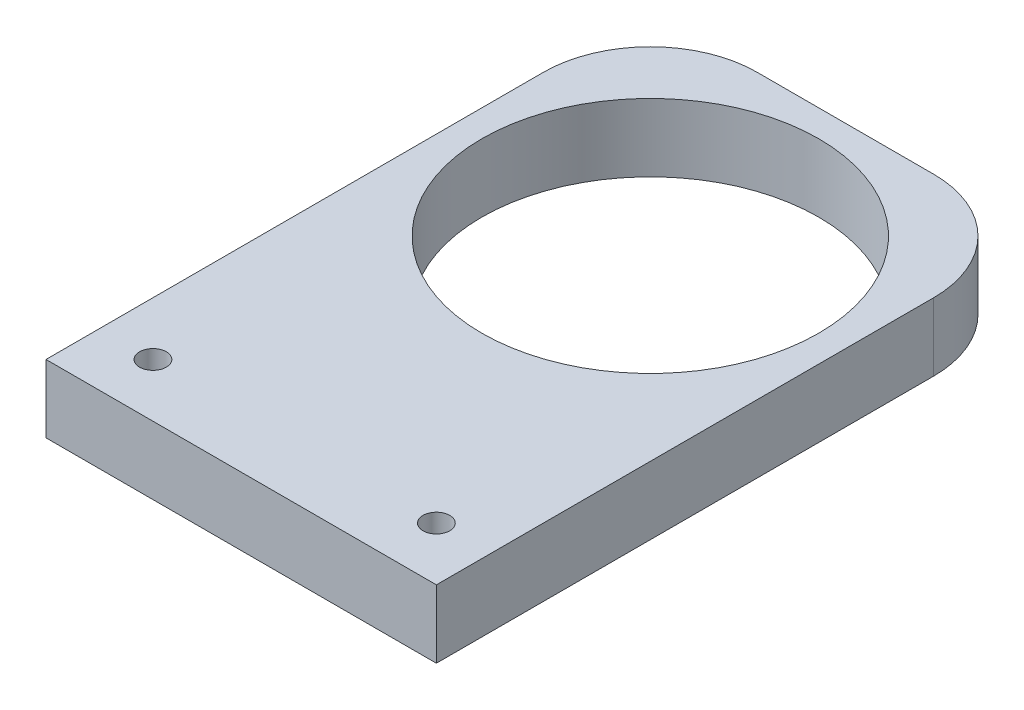
ISO-10303-21;
HEADER;
FILE_DESCRIPTION(('STEP AP214'),'2;1');
FILE_NAME('part.step','',(''),(''),'','','');
FILE_SCHEMA(('AUTOMOTIVE_DESIGN { 1 0 10303 214 1 1 1 1 }'));
ENDSEC;
DATA;
#1=APPLICATION_CONTEXT('core data for automotive mechanical design processes');
#2=APPLICATION_PROTOCOL_DEFINITION('international standard','automotive_design',2000,#1);
#3=PRODUCT_CONTEXT('',#1,'mechanical');
#4=PRODUCT('Part','Part','',(#3));
#5=PRODUCT_RELATED_PRODUCT_CATEGORY('part','',(#4));
#6=PRODUCT_DEFINITION_FORMATION('','',#4);
#7=PRODUCT_DEFINITION_CONTEXT('part definition',#1,'design');
#8=PRODUCT_DEFINITION('design','',#6,#7);
#9=PRODUCT_DEFINITION_SHAPE('','',#8);
#10=(LENGTH_UNIT() NAMED_UNIT(*) SI_UNIT(.MILLI.,.METRE.));
#11=(NAMED_UNIT(*) PLANE_ANGLE_UNIT() SI_UNIT($,.RADIAN.));
#12=(NAMED_UNIT(*) SI_UNIT($,.STERADIAN.) SOLID_ANGLE_UNIT());
#13=UNCERTAINTY_MEASURE_WITH_UNIT(LENGTH_MEASURE(1.E-05),#10,'distance_accuracy_value','');
#14=(GEOMETRIC_REPRESENTATION_CONTEXT(3) GLOBAL_UNCERTAINTY_ASSIGNED_CONTEXT((#13)) GLOBAL_UNIT_ASSIGNED_CONTEXT((#10,
#11,#12)) REPRESENTATION_CONTEXT('',''));
#15=CARTESIAN_POINT('',(0.,0.,0.));
#16=DIRECTION('',(0.,0.,1.));
#17=DIRECTION('',(1.,0.,0.));
#18=AXIS2_PLACEMENT_3D('',#15,#16,#17);
#19=CARTESIAN_POINT('',(0.,6.35,0.));
#20=DIRECTION('',(0.,-1.,0.));
#21=DIRECTION('',(0.,0.,-1.));
#22=AXIS2_PLACEMENT_3D('',#19,#20,#21);
#23=PLANE('',#22);
#24=DIRECTION('',(-1.,0.,0.));
#25=VECTOR('',#24,1.);
#26=CARTESIAN_POINT('',(-36.5,6.35,-36.5));
#27=LINE('',#26,#25);
#28=CARTESIAN_POINT('',(16.5,6.35,-36.5));
#29=VERTEX_POINT('',#28);
#30=CARTESIAN_POINT('',(-16.5,6.35,-36.5));
#31=VERTEX_POINT('',#30);
#32=EDGE_CURVE('E129',#29,#31,#27,.T.);
#33=ORIENTED_EDGE('',*,*,#32,.T.);
#34=CARTESIAN_POINT('',(-16.5,6.35,-16.5));
#35=DIRECTION('',(0.,-1.,0.));
#36=DIRECTION('',(0.,0.,-1.));
#37=AXIS2_PLACEMENT_3D('',#34,#35,#36);
#38=CIRCLE('',#37,20.);
#39=CARTESIAN_POINT('',(-36.5,6.35,-16.5));
#40=VERTEX_POINT('',#39);
#41=EDGE_CURVE('E41',#31,#40,#38,.F.);
#42=ORIENTED_EDGE('',*,*,#41,.T.);
#43=DIRECTION('',(0.,0.,1.));
#44=VECTOR('',#43,1.);
#45=CARTESIAN_POINT('',(-36.5,6.35,36.5));
#46=LINE('',#45,#44);
#47=CARTESIAN_POINT('',(-36.5,6.35,76.5));
#48=VERTEX_POINT('',#47);
#49=EDGE_CURVE('E131',#40,#48,#46,.T.);
#50=ORIENTED_EDGE('',*,*,#49,.T.);
#51=DIRECTION('',(1.,0.,0.));
#52=VECTOR('',#51,1.);
#53=CARTESIAN_POINT('',(-36.5,6.35,76.5));
#54=LINE('',#53,#52);
#55=CARTESIAN_POINT('',(36.5,6.35,76.5));
#56=VERTEX_POINT('',#55);
#57=EDGE_CURVE('E107',#48,#56,#54,.T.);
#58=ORIENTED_EDGE('',*,*,#57,.T.);
#59=DIRECTION('',(0.,0.,-1.));
#60=VECTOR('',#59,1.);
#61=CARTESIAN_POINT('',(36.5,6.35,36.5));
#62=LINE('',#61,#60);
#63=CARTESIAN_POINT('',(36.5,6.35,-16.5));
#64=VERTEX_POINT('',#63);
#65=EDGE_CURVE('E98',#56,#64,#62,.T.);
#66=ORIENTED_EDGE('',*,*,#65,.T.);
#67=CARTESIAN_POINT('',(16.5,6.35,-16.5));
#68=DIRECTION('',(0.,-1.,0.));
#69=DIRECTION('',(0.,0.,-1.));
#70=AXIS2_PLACEMENT_3D('',#67,#68,#69);
#71=CIRCLE('',#70,20.);
#72=EDGE_CURVE('E144',#64,#29,#71,.F.);
#73=ORIENTED_EDGE('',*,*,#72,.T.);
#74=EDGE_LOOP('',(#33,#42,#50,#58,#66,#73));
#75=FACE_BOUND('',#74,.T.);
#76=CARTESIAN_POINT('',(0.,6.35,0.));
#77=DIRECTION('',(0.,1.,0.));
#78=DIRECTION('',(0.,0.,1.));
#79=AXIS2_PLACEMENT_3D('',#76,#77,#78);
#80=CIRCLE('',#79,31.5);
#81=CARTESIAN_POINT('',(0.,6.35,31.5));
#82=VERTEX_POINT('',#81);
#83=EDGE_CURVE('E123',#82,#82,#80,.T.);
#84=ORIENTED_EDGE('',*,*,#83,.F.);
#85=EDGE_LOOP('',(#84));
#86=FACE_BOUND('',#85,.T.);
#87=CARTESIAN_POINT('',(26.5,6.35,66.5));
#88=DIRECTION('',(0.,1.,0.));
#89=DIRECTION('',(0.,0.,1.));
#90=AXIS2_PLACEMENT_3D('',#87,#88,#89);
#91=CIRCLE('',#90,2.5);
#92=CARTESIAN_POINT('',(26.5,6.35,69.));
#93=VERTEX_POINT('',#92);
#94=EDGE_CURVE('E194',#93,#93,#91,.T.);
#95=ORIENTED_EDGE('',*,*,#94,.F.);
#96=EDGE_LOOP('',(#95));
#97=FACE_BOUND('',#96,.T.);
#98=CARTESIAN_POINT('',(-26.5,6.35,66.5));
#99=DIRECTION('',(0.,1.,0.));
#100=DIRECTION('',(0.,0.,1.));
#101=AXIS2_PLACEMENT_3D('',#98,#99,#100);
#102=CIRCLE('',#101,2.5);
#103=CARTESIAN_POINT('',(-26.5,6.35,69.));
#104=VERTEX_POINT('',#103);
#105=EDGE_CURVE('E118',#104,#104,#102,.T.);
#106=ORIENTED_EDGE('',*,*,#105,.F.);
#107=EDGE_LOOP('',(#106));
#108=FACE_BOUND('',#107,.T.);
#109=ADVANCED_FACE('F33',(#75,#86,#97,#108),#23,.F.);
#110=CARTESIAN_POINT('',(0.,-6.35,0.));
#111=DIRECTION('',(0.,-1.,0.));
#112=DIRECTION('',(0.,0.,-1.));
#113=AXIS2_PLACEMENT_3D('',#110,#111,#112);
#114=PLANE('',#113);
#115=DIRECTION('',(0.,0.,1.));
#116=VECTOR('',#115,1.);
#117=CARTESIAN_POINT('',(-36.5,-6.35,36.5));
#118=LINE('',#117,#116);
#119=CARTESIAN_POINT('',(-36.5,-6.35,-16.5));
#120=VERTEX_POINT('',#119);
#121=CARTESIAN_POINT('',(-36.5,-6.35,76.5));
#122=VERTEX_POINT('',#121);
#123=EDGE_CURVE('E88',#120,#122,#118,.T.);
#124=ORIENTED_EDGE('',*,*,#123,.F.);
#125=CARTESIAN_POINT('',(-16.5,-6.35,-16.5));
#126=DIRECTION('',(0.,-1.,0.));
#127=DIRECTION('',(0.,0.,-1.));
#128=AXIS2_PLACEMENT_3D('',#125,#126,#127);
#129=CIRCLE('',#128,20.);
#130=CARTESIAN_POINT('',(-16.5,-6.35,-36.5));
#131=VERTEX_POINT('',#130);
#132=EDGE_CURVE('E138',#120,#131,#129,.T.);
#133=ORIENTED_EDGE('',*,*,#132,.T.);
#134=DIRECTION('',(-1.,0.,0.));
#135=VECTOR('',#134,1.);
#136=CARTESIAN_POINT('',(-36.5,-6.35,-36.5));
#137=LINE('',#136,#135);
#138=CARTESIAN_POINT('',(16.5,-6.35,-36.5));
#139=VERTEX_POINT('',#138);
#140=EDGE_CURVE('E99',#139,#131,#137,.T.);
#141=ORIENTED_EDGE('',*,*,#140,.F.);
#142=CARTESIAN_POINT('',(16.5,-6.35,-16.5));
#143=DIRECTION('',(0.,-1.,0.));
#144=DIRECTION('',(0.,0.,-1.));
#145=AXIS2_PLACEMENT_3D('',#142,#143,#144);
#146=CIRCLE('',#145,20.);
#147=CARTESIAN_POINT('',(36.5,-6.35,-16.5));
#148=VERTEX_POINT('',#147);
#149=EDGE_CURVE('E136',#139,#148,#146,.T.);
#150=ORIENTED_EDGE('',*,*,#149,.T.);
#151=DIRECTION('',(0.,0.,-1.));
#152=VECTOR('',#151,1.);
#153=CARTESIAN_POINT('',(36.5,-6.35,36.5));
#154=LINE('',#153,#152);
#155=CARTESIAN_POINT('',(36.5,-6.35,76.5));
#156=VERTEX_POINT('',#155);
#157=EDGE_CURVE('E112',#156,#148,#154,.T.);
#158=ORIENTED_EDGE('',*,*,#157,.F.);
#159=DIRECTION('',(1.,0.,0.));
#160=VECTOR('',#159,1.);
#161=CARTESIAN_POINT('',(-36.5,-6.35,76.5));
#162=LINE('',#161,#160);
#163=EDGE_CURVE('E105',#122,#156,#162,.T.);
#164=ORIENTED_EDGE('',*,*,#163,.F.);
#165=EDGE_LOOP('',(#124,#133,#141,#150,#158,#164));
#166=FACE_BOUND('',#165,.T.);
#167=CARTESIAN_POINT('',(0.,-6.35,0.));
#168=DIRECTION('',(0.,1.,0.));
#169=DIRECTION('',(0.,0.,1.));
#170=AXIS2_PLACEMENT_3D('',#167,#168,#169);
#171=CIRCLE('',#170,31.5);
#172=CARTESIAN_POINT('',(0.,-6.35,31.5));
#173=VERTEX_POINT('',#172);
#174=EDGE_CURVE('E121',#173,#173,#171,.T.);
#175=ORIENTED_EDGE('',*,*,#174,.T.);
#176=EDGE_LOOP('',(#175));
#177=FACE_BOUND('',#176,.T.);
#178=CARTESIAN_POINT('',(26.5,-6.35,66.5));
#179=DIRECTION('',(0.,1.,0.));
#180=DIRECTION('',(0.,0.,1.));
#181=AXIS2_PLACEMENT_3D('',#178,#179,#180);
#182=CIRCLE('',#181,2.5);
#183=CARTESIAN_POINT('',(26.5,-6.35,69.));
#184=VERTEX_POINT('',#183);
#185=EDGE_CURVE('E188',#184,#184,#182,.T.);
#186=ORIENTED_EDGE('',*,*,#185,.T.);
#187=EDGE_LOOP('',(#186));
#188=FACE_BOUND('',#187,.T.);
#189=CARTESIAN_POINT('',(-26.5,-6.35,66.5));
#190=DIRECTION('',(0.,1.,0.));
#191=DIRECTION('',(0.,0.,1.));
#192=AXIS2_PLACEMENT_3D('',#189,#190,#191);
#193=CIRCLE('',#192,2.5);
#194=CARTESIAN_POINT('',(-26.5,-6.35,69.));
#195=VERTEX_POINT('',#194);
#196=EDGE_CURVE('E115',#195,#195,#193,.T.);
#197=ORIENTED_EDGE('',*,*,#196,.T.);
#198=EDGE_LOOP('',(#197));
#199=FACE_BOUND('',#198,.T.);
#200=ADVANCED_FACE('F110',(#166,#177,#188,#199),#114,.T.);
#201=CARTESIAN_POINT('',(36.5,6.35,36.5));
#202=DIRECTION('',(-1.,0.,0.));
#203=DIRECTION('',(0.,0.,1.));
#204=AXIS2_PLACEMENT_3D('',#201,#202,#203);
#205=PLANE('',#204);
#206=ORIENTED_EDGE('',*,*,#157,.T.);
#207=DIRECTION('',(0.,-1.,0.));
#208=VECTOR('',#207,1.);
#209=CARTESIAN_POINT('',(36.5,6.35,-16.5));
#210=LINE('',#209,#208);
#211=EDGE_CURVE('E11',#148,#64,#210,.F.);
#212=ORIENTED_EDGE('',*,*,#211,.T.);
#213=ORIENTED_EDGE('',*,*,#65,.F.);
#214=DIRECTION('',(0.,1.,0.));
#215=VECTOR('',#214,1.);
#216=CARTESIAN_POINT('',(36.5,-6.35,76.5));
#217=LINE('',#216,#215);
#218=EDGE_CURVE('E108',#156,#56,#217,.T.);
#219=ORIENTED_EDGE('',*,*,#218,.F.);
#220=EDGE_LOOP('',(#206,#212,#213,#219));
#221=FACE_BOUND('',#220,.T.);
#222=ADVANCED_FACE('F155',(#221),#205,.F.);
#223=CARTESIAN_POINT('',(-36.5,6.35,-36.5));
#224=DIRECTION('',(0.,0.,1.));
#225=DIRECTION('',(1.,0.,0.));
#226=AXIS2_PLACEMENT_3D('',#223,#224,#225);
#227=PLANE('',#226);
#228=ORIENTED_EDGE('',*,*,#140,.T.);
#229=DIRECTION('',(0.,-1.,0.));
#230=VECTOR('',#229,1.);
#231=CARTESIAN_POINT('',(-16.5,6.35,-36.5));
#232=LINE('',#231,#230);
#233=EDGE_CURVE('E54',#131,#31,#232,.F.);
#234=ORIENTED_EDGE('',*,*,#233,.T.);
#235=ORIENTED_EDGE('',*,*,#32,.F.);
#236=DIRECTION('',(0.,-1.,0.));
#237=VECTOR('',#236,1.);
#238=CARTESIAN_POINT('',(16.5,6.35,-36.5));
#239=LINE('',#238,#237);
#240=EDGE_CURVE('E140',#29,#139,#239,.T.);
#241=ORIENTED_EDGE('',*,*,#240,.T.);
#242=EDGE_LOOP('',(#228,#234,#235,#241));
#243=FACE_BOUND('',#242,.T.);
#244=ADVANCED_FACE('F151',(#243),#227,.F.);
#245=CARTESIAN_POINT('',(-36.5,6.35,36.5));
#246=DIRECTION('',(1.,0.,0.));
#247=DIRECTION('',(0.,0.,-1.));
#248=AXIS2_PLACEMENT_3D('',#245,#246,#247);
#249=PLANE('',#248);
#250=ORIENTED_EDGE('',*,*,#49,.F.);
#251=DIRECTION('',(0.,-1.,0.));
#252=VECTOR('',#251,1.);
#253=CARTESIAN_POINT('',(-36.5,6.35,-16.5));
#254=LINE('',#253,#252);
#255=EDGE_CURVE('E95',#40,#120,#254,.T.);
#256=ORIENTED_EDGE('',*,*,#255,.T.);
#257=ORIENTED_EDGE('',*,*,#123,.T.);
#258=DIRECTION('',(0.,1.,0.));
#259=VECTOR('',#258,1.);
#260=CARTESIAN_POINT('',(-36.5,-6.35,76.5));
#261=LINE('',#260,#259);
#262=EDGE_CURVE('E92',#122,#48,#261,.T.);
#263=ORIENTED_EDGE('',*,*,#262,.T.);
#264=EDGE_LOOP('',(#250,#256,#257,#263));
#265=FACE_BOUND('',#264,.T.);
#266=ADVANCED_FACE('F91',(#265),#249,.F.);
#267=CARTESIAN_POINT('',(0.,6.35,0.));
#268=DIRECTION('',(0.,-1.,0.));
#269=DIRECTION('',(0.,0.,-1.));
#270=AXIS2_PLACEMENT_3D('',#267,#268,#269);
#271=CYLINDRICAL_SURFACE('',#270,31.5);
#272=ORIENTED_EDGE('',*,*,#83,.T.);
#273=EDGE_LOOP('',(#272));
#274=FACE_BOUND('',#273,.T.);
#275=ORIENTED_EDGE('',*,*,#174,.F.);
#276=EDGE_LOOP('',(#275));
#277=FACE_BOUND('',#276,.T.);
#278=ADVANCED_FACE('F169',(#274,#277),#271,.F.);
#279=CARTESIAN_POINT('',(-36.5,-6.35,76.5));
#280=DIRECTION('',(0.,0.,1.));
#281=DIRECTION('',(1.,0.,0.));
#282=AXIS2_PLACEMENT_3D('',#279,#280,#281);
#283=PLANE('',#282);
#284=ORIENTED_EDGE('',*,*,#57,.F.);
#285=ORIENTED_EDGE('',*,*,#262,.F.);
#286=ORIENTED_EDGE('',*,*,#163,.T.);
#287=ORIENTED_EDGE('',*,*,#218,.T.);
#288=EDGE_LOOP('',(#284,#285,#286,#287));
#289=FACE_BOUND('',#288,.T.);
#290=ADVANCED_FACE('F103',(#289),#283,.T.);
#291=CARTESIAN_POINT('',(-26.5,-6.35,66.5));
#292=DIRECTION('',(0.,1.,0.));
#293=DIRECTION('',(0.,0.,1.));
#294=AXIS2_PLACEMENT_3D('',#291,#292,#293);
#295=CYLINDRICAL_SURFACE('',#294,2.5);
#296=ORIENTED_EDGE('',*,*,#196,.F.);
#297=EDGE_LOOP('',(#296));
#298=FACE_BOUND('',#297,.T.);
#299=ORIENTED_EDGE('',*,*,#105,.T.);
#300=EDGE_LOOP('',(#299));
#301=FACE_BOUND('',#300,.T.);
#302=ADVANCED_FACE('F180',(#298,#301),#295,.F.);
#303=CARTESIAN_POINT('',(26.5,-6.35,66.5));
#304=DIRECTION('',(0.,1.,0.));
#305=DIRECTION('',(0.,0.,1.));
#306=AXIS2_PLACEMENT_3D('',#303,#304,#305);
#307=CYLINDRICAL_SURFACE('',#306,2.5);
#308=ORIENTED_EDGE('',*,*,#185,.F.);
#309=EDGE_LOOP('',(#308));
#310=FACE_BOUND('',#309,.T.);
#311=ORIENTED_EDGE('',*,*,#94,.T.);
#312=EDGE_LOOP('',(#311));
#313=FACE_BOUND('',#312,.T.);
#314=ADVANCED_FACE('F199',(#310,#313),#307,.F.);
#315=CARTESIAN_POINT('',(-16.5,6.35,-16.5));
#316=DIRECTION('',(0.,-1.,0.));
#317=DIRECTION('',(0.,0.,-1.));
#318=AXIS2_PLACEMENT_3D('',#315,#316,#317);
#319=CYLINDRICAL_SURFACE('',#318,20.);
#320=ORIENTED_EDGE('',*,*,#41,.F.);
#321=ORIENTED_EDGE('',*,*,#233,.F.);
#322=ORIENTED_EDGE('',*,*,#132,.F.);
#323=ORIENTED_EDGE('',*,*,#255,.F.);
#324=EDGE_LOOP('',(#320,#321,#322,#323));
#325=FACE_BOUND('',#324,.T.);
#326=ADVANCED_FACE('F149',(#325),#319,.T.);
#327=CARTESIAN_POINT('',(16.5,6.35,-16.5));
#328=DIRECTION('',(0.,-1.,0.));
#329=DIRECTION('',(0.,0.,-1.));
#330=AXIS2_PLACEMENT_3D('',#327,#328,#329);
#331=CYLINDRICAL_SURFACE('',#330,20.);
#332=ORIENTED_EDGE('',*,*,#72,.F.);
#333=ORIENTED_EDGE('',*,*,#211,.F.);
#334=ORIENTED_EDGE('',*,*,#149,.F.);
#335=ORIENTED_EDGE('',*,*,#240,.F.);
#336=EDGE_LOOP('',(#332,#333,#334,#335));
#337=FACE_BOUND('',#336,.T.);
#338=ADVANCED_FACE('F35',(#337),#331,.T.);
#339=CLOSED_SHELL('',(#109,#200,#222,#244,#266,#278,#290,#302,#314,#326,#338));
#340=MANIFOLD_SOLID_BREP('B2',#339);
#341=ADVANCED_BREP_SHAPE_REPRESENTATION('',(#18,#340),#14);
#342=SHAPE_DEFINITION_REPRESENTATION(#9,#341);
ENDSEC;
END-ISO-10303-21;
